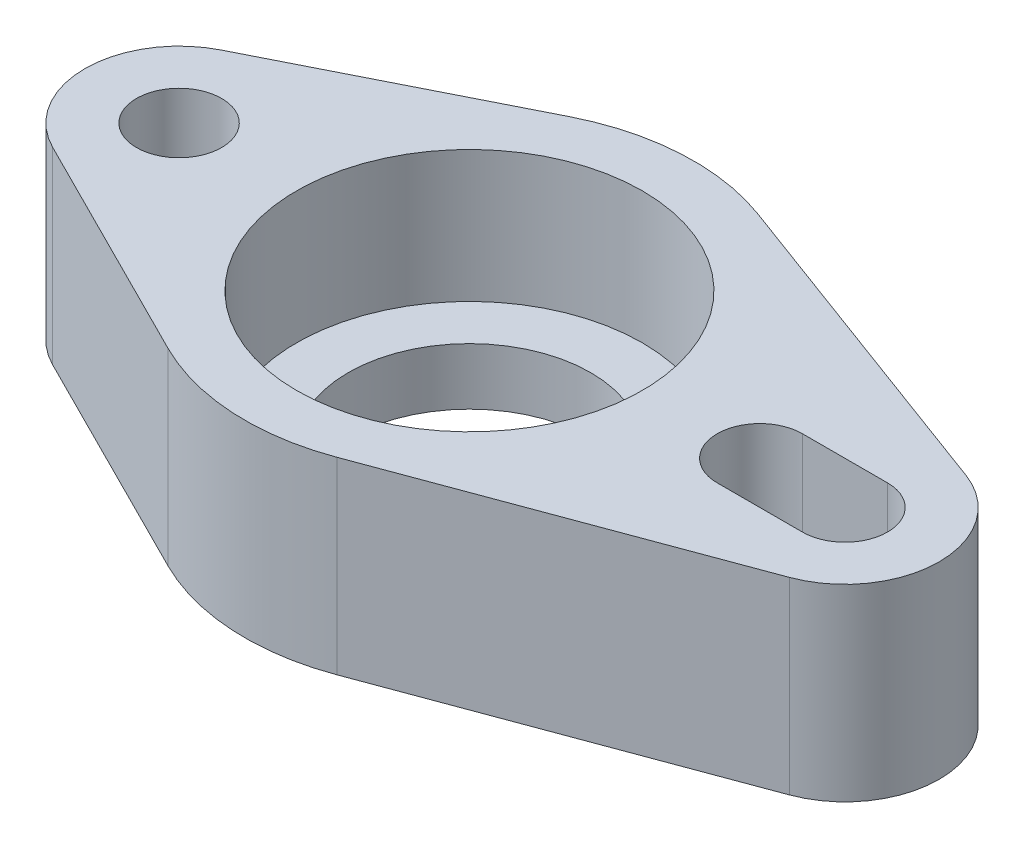
ISO-10303-21;
HEADER;
FILE_DESCRIPTION(('STEP AP214'),'2;1');
FILE_NAME('part.step','',(''),(''),'','','');
FILE_SCHEMA(('AUTOMOTIVE_DESIGN { 1 0 10303 214 1 1 1 1 }'));
ENDSEC;
DATA;
#1=APPLICATION_CONTEXT('core data for automotive mechanical design processes');
#2=APPLICATION_PROTOCOL_DEFINITION('international standard','automotive_design',2000,#1);
#3=PRODUCT_CONTEXT('',#1,'mechanical');
#4=PRODUCT('Part','Part','',(#3));
#5=PRODUCT_RELATED_PRODUCT_CATEGORY('part','',(#4));
#6=PRODUCT_DEFINITION_FORMATION('','',#4);
#7=PRODUCT_DEFINITION_CONTEXT('part definition',#1,'design');
#8=PRODUCT_DEFINITION('design','',#6,#7);
#9=PRODUCT_DEFINITION_SHAPE('','',#8);
#10=(LENGTH_UNIT() NAMED_UNIT(*) SI_UNIT(.MILLI.,.METRE.));
#11=(NAMED_UNIT(*) PLANE_ANGLE_UNIT() SI_UNIT($,.RADIAN.));
#12=(NAMED_UNIT(*) SI_UNIT($,.STERADIAN.) SOLID_ANGLE_UNIT());
#13=UNCERTAINTY_MEASURE_WITH_UNIT(LENGTH_MEASURE(1.E-05),#10,'distance_accuracy_value','');
#14=(GEOMETRIC_REPRESENTATION_CONTEXT(3) GLOBAL_UNCERTAINTY_ASSIGNED_CONTEXT((#13)) GLOBAL_UNIT_ASSIGNED_CONTEXT((#10,
#11,#12)) REPRESENTATION_CONTEXT('',''));
#15=CARTESIAN_POINT('',(0.,0.,0.));
#16=DIRECTION('',(0.,0.,1.));
#17=DIRECTION('',(1.,0.,0.));
#18=AXIS2_PLACEMENT_3D('',#15,#16,#17);
#19=CARTESIAN_POINT('',(3.01958762886598,7.3,8.15917217318029));
#20=DIRECTION('',(0.347079037800687,0.,0.937835881974746));
#21=DIRECTION('',(0.937835881974746,0.,-0.347079037800687));
#22=AXIS2_PLACEMENT_3D('',#19,#20,#21);
#23=PLANE('',#22);
#24=DIRECTION('',(-0.937835881974746,0.,0.347079037800687));
#25=VECTOR('',#24,1.);
#26=CARTESIAN_POINT('',(3.01958762886598,0.,8.15917217318029));
#27=LINE('',#26,#25);
#28=CARTESIAN_POINT('',(15.8168384879725,0.,3.42310096920782));
#29=VERTEX_POINT('',#28);
#30=CARTESIAN_POINT('',(3.01958762886598,0.,8.15917217318029));
#31=VERTEX_POINT('',#30);
#32=EDGE_CURVE('E211',#29,#31,#27,.T.);
#33=ORIENTED_EDGE('',*,*,#32,.F.);
#34=DIRECTION('',(0.,-1.,0.));
#35=VECTOR('',#34,1.);
#36=CARTESIAN_POINT('',(15.8168384879725,7.3,3.42310096920782));
#37=LINE('',#36,#35);
#38=CARTESIAN_POINT('',(15.8168384879725,7.3,3.42310096920782));
#39=VERTEX_POINT('',#38);
#40=EDGE_CURVE('E54',#39,#29,#37,.T.);
#41=ORIENTED_EDGE('',*,*,#40,.F.);
#42=DIRECTION('',(-0.937835881974746,0.,0.347079037800687));
#43=VECTOR('',#42,1.);
#44=CARTESIAN_POINT('',(3.01958762886598,7.3,8.15917217318029));
#45=LINE('',#44,#43);
#46=CARTESIAN_POINT('',(3.01958762886598,7.3,8.15917217318029));
#47=VERTEX_POINT('',#46);
#48=EDGE_CURVE('E240',#39,#47,#45,.T.);
#49=ORIENTED_EDGE('',*,*,#48,.T.);
#50=DIRECTION('',(0.,-1.,0.));
#51=VECTOR('',#50,1.);
#52=CARTESIAN_POINT('',(3.01958762886598,7.3,8.15917217318029));
#53=LINE('',#52,#51);
#54=EDGE_CURVE('E109',#47,#31,#53,.T.);
#55=ORIENTED_EDGE('',*,*,#54,.T.);
#56=EDGE_LOOP('',(#33,#41,#49,#55));
#57=FACE_BOUND('',#56,.T.);
#58=ADVANCED_FACE('F45',(#57),#23,.T.);
#59=CARTESIAN_POINT('',(14.55,7.3,0.));
#60=DIRECTION('',(0.,-1.,0.));
#61=DIRECTION('',(0.,0.,-1.));
#62=AXIS2_PLACEMENT_3D('',#59,#60,#61);
#63=CYLINDRICAL_SURFACE('',#62,3.65);
#64=CARTESIAN_POINT('',(14.55,0.,0.));
#65=DIRECTION('',(0.,1.,0.));
#66=DIRECTION('',(0.,0.,1.));
#67=AXIS2_PLACEMENT_3D('',#64,#65,#66);
#68=CIRCLE('',#67,3.65);
#69=CARTESIAN_POINT('',(15.8168384879725,0.,-3.42310096920782));
#70=VERTEX_POINT('',#69);
#71=EDGE_CURVE('E208',#29,#70,#68,.T.);
#72=ORIENTED_EDGE('',*,*,#71,.T.);
#73=DIRECTION('',(0.,-1.,0.));
#74=VECTOR('',#73,1.);
#75=CARTESIAN_POINT('',(15.8168384879725,7.3,-3.42310096920782));
#76=LINE('',#75,#74);
#77=CARTESIAN_POINT('',(15.8168384879725,7.3,-3.42310096920782));
#78=VERTEX_POINT('',#77);
#79=EDGE_CURVE('E177',#78,#70,#76,.T.);
#80=ORIENTED_EDGE('',*,*,#79,.F.);
#81=CARTESIAN_POINT('',(14.55,7.3,0.));
#82=DIRECTION('',(0.,1.,0.));
#83=DIRECTION('',(0.,0.,1.));
#84=AXIS2_PLACEMENT_3D('',#81,#82,#83);
#85=CIRCLE('',#84,3.65);
#86=EDGE_CURVE('E237',#39,#78,#85,.T.);
#87=ORIENTED_EDGE('',*,*,#86,.F.);
#88=ORIENTED_EDGE('',*,*,#40,.T.);
#89=EDGE_LOOP('',(#72,#80,#87,#88));
#90=FACE_BOUND('',#89,.T.);
#91=ADVANCED_FACE('F297',(#90),#63,.T.);
#92=CARTESIAN_POINT('',(3.01958762886598,7.3,-8.15917217318029));
#93=DIRECTION('',(-0.347079037800687,0.,0.937835881974746));
#94=DIRECTION('',(0.937835881974746,0.,0.347079037800687));
#95=AXIS2_PLACEMENT_3D('',#92,#93,#94);
#96=PLANE('',#95);
#97=DIRECTION('',(-0.937835881974746,0.,-0.347079037800687));
#98=VECTOR('',#97,1.);
#99=CARTESIAN_POINT('',(3.01958762886598,0.,-8.15917217318029));
#100=LINE('',#99,#98);
#101=CARTESIAN_POINT('',(3.01958762886598,0.,-8.15917217318029));
#102=VERTEX_POINT('',#101);
#103=EDGE_CURVE('E205',#70,#102,#100,.T.);
#104=ORIENTED_EDGE('',*,*,#103,.T.);
#105=DIRECTION('',(0.,-1.,0.));
#106=VECTOR('',#105,1.);
#107=CARTESIAN_POINT('',(3.01958762886598,7.3,-8.15917217318029));
#108=LINE('',#107,#106);
#109=CARTESIAN_POINT('',(3.01958762886598,7.3,-8.15917217318029));
#110=VERTEX_POINT('',#109);
#111=EDGE_CURVE('E174',#110,#102,#108,.T.);
#112=ORIENTED_EDGE('',*,*,#111,.F.);
#113=DIRECTION('',(-0.937835881974746,0.,-0.347079037800687));
#114=VECTOR('',#113,1.);
#115=CARTESIAN_POINT('',(3.01958762886598,7.3,-8.15917217318029));
#116=LINE('',#115,#114);
#117=EDGE_CURVE('E234',#78,#110,#116,.T.);
#118=ORIENTED_EDGE('',*,*,#117,.F.);
#119=ORIENTED_EDGE('',*,*,#79,.T.);
#120=EDGE_LOOP('',(#104,#112,#118,#119));
#121=FACE_BOUND('',#120,.T.);
#122=ADVANCED_FACE('F302',(#121),#96,.F.);
#123=CARTESIAN_POINT('',(0.,7.3,0.));
#124=DIRECTION('',(0.,-1.,0.));
#125=DIRECTION('',(0.,0.,-1.));
#126=AXIS2_PLACEMENT_3D('',#123,#124,#125);
#127=CYLINDRICAL_SURFACE('',#126,8.7);
#128=CARTESIAN_POINT('',(0.,0.,0.));
#129=DIRECTION('',(0.,1.,0.));
#130=DIRECTION('',(0.,0.,1.));
#131=AXIS2_PLACEMENT_3D('',#128,#129,#130);
#132=CIRCLE('',#131,8.7);
#133=CARTESIAN_POINT('',(-3.90533333333333,0.,-7.77421195720541));
#134=VERTEX_POINT('',#133);
#135=EDGE_CURVE('E202',#102,#134,#132,.T.);
#136=ORIENTED_EDGE('',*,*,#135,.T.);
#137=DIRECTION('',(0.,-1.,0.));
#138=VECTOR('',#137,1.);
#139=CARTESIAN_POINT('',(-3.90533333333333,7.3,-7.77421195720541));
#140=LINE('',#139,#138);
#141=CARTESIAN_POINT('',(-3.90533333333333,7.3,-7.77421195720541));
#142=VERTEX_POINT('',#141);
#143=EDGE_CURVE('E168',#142,#134,#140,.T.);
#144=ORIENTED_EDGE('',*,*,#143,.F.);
#145=CARTESIAN_POINT('',(0.,7.3,0.));
#146=DIRECTION('',(0.,1.,0.));
#147=DIRECTION('',(0.,0.,1.));
#148=AXIS2_PLACEMENT_3D('',#145,#146,#147);
#149=CIRCLE('',#148,8.7);
#150=EDGE_CURVE('E232',#110,#142,#149,.T.);
#151=ORIENTED_EDGE('',*,*,#150,.F.);
#152=ORIENTED_EDGE('',*,*,#111,.T.);
#153=EDGE_LOOP('',(#136,#144,#151,#152));
#154=FACE_BOUND('',#153,.T.);
#155=ADVANCED_FACE('F330',(#154),#127,.T.);
#156=CARTESIAN_POINT('',(-3.90533333333333,7.3,-7.77421195720541));
#157=DIRECTION('',(-0.448888888888889,0.,-0.893587581287978));
#158=DIRECTION('',(-0.893587581287978,0.,0.448888888888889));
#159=AXIS2_PLACEMENT_3D('',#156,#157,#158);
#160=PLANE('',#159);
#161=DIRECTION('',(0.893587581287978,0.,-0.448888888888889));
#162=VECTOR('',#161,1.);
#163=CARTESIAN_POINT('',(-3.90533333333333,0.,-7.77421195720541));
#164=LINE('',#163,#162);
#165=CARTESIAN_POINT('',(-12.8884444444444,0.,-3.26159467170112));
#166=VERTEX_POINT('',#165);
#167=EDGE_CURVE('E199',#166,#134,#164,.T.);
#168=ORIENTED_EDGE('',*,*,#167,.F.);
#169=DIRECTION('',(0.,-1.,0.));
#170=VECTOR('',#169,1.);
#171=CARTESIAN_POINT('',(-12.8884444444444,7.3,-3.26159467170112));
#172=LINE('',#171,#170);
#173=CARTESIAN_POINT('',(-12.8884444444444,7.3,-3.26159467170112));
#174=VERTEX_POINT('',#173);
#175=EDGE_CURVE('E166',#174,#166,#172,.T.);
#176=ORIENTED_EDGE('',*,*,#175,.F.);
#177=DIRECTION('',(0.893587581287978,0.,-0.448888888888889));
#178=VECTOR('',#177,1.);
#179=CARTESIAN_POINT('',(-3.90533333333333,7.3,-7.77421195720541));
#180=LINE('',#179,#178);
#181=EDGE_CURVE('E160',#174,#142,#180,.T.);
#182=ORIENTED_EDGE('',*,*,#181,.T.);
#183=ORIENTED_EDGE('',*,*,#143,.T.);
#184=EDGE_LOOP('',(#168,#176,#182,#183));
#185=FACE_BOUND('',#184,.T.);
#186=ADVANCED_FACE('F333',(#185),#160,.T.);
#187=CARTESIAN_POINT('',(-11.25,7.3,0.));
#188=DIRECTION('',(0.,-1.,0.));
#189=DIRECTION('',(0.,0.,-1.));
#190=AXIS2_PLACEMENT_3D('',#187,#188,#189);
#191=CYLINDRICAL_SURFACE('',#190,3.65);
#192=CARTESIAN_POINT('',(-11.25,0.,0.));
#193=DIRECTION('',(0.,1.,0.));
#194=DIRECTION('',(0.,0.,1.));
#195=AXIS2_PLACEMENT_3D('',#192,#193,#194);
#196=CIRCLE('',#195,3.65);
#197=CARTESIAN_POINT('',(-12.8884444444444,0.,3.26159467170112));
#198=VERTEX_POINT('',#197);
#199=EDGE_CURVE('E165',#166,#198,#196,.T.);
#200=ORIENTED_EDGE('',*,*,#199,.T.);
#201=DIRECTION('',(0.,-1.,0.));
#202=VECTOR('',#201,1.);
#203=CARTESIAN_POINT('',(-12.8884444444444,7.3,3.26159467170112));
#204=LINE('',#203,#202);
#205=CARTESIAN_POINT('',(-12.8884444444444,7.3,3.26159467170112));
#206=VERTEX_POINT('',#205);
#207=EDGE_CURVE('E150',#206,#198,#204,.T.);
#208=ORIENTED_EDGE('',*,*,#207,.F.);
#209=CARTESIAN_POINT('',(-11.25,7.3,0.));
#210=DIRECTION('',(0.,1.,0.));
#211=DIRECTION('',(0.,0.,1.));
#212=AXIS2_PLACEMENT_3D('',#209,#210,#211);
#213=CIRCLE('',#212,3.65);
#214=EDGE_CURVE('E153',#174,#206,#213,.T.);
#215=ORIENTED_EDGE('',*,*,#214,.F.);
#216=ORIENTED_EDGE('',*,*,#175,.T.);
#217=EDGE_LOOP('',(#200,#208,#215,#216));
#218=FACE_BOUND('',#217,.T.);
#219=ADVANCED_FACE('F163',(#218),#191,.T.);
#220=CARTESIAN_POINT('',(-3.90533333333333,7.3,7.77421195720541));
#221=DIRECTION('',(0.448888888888889,0.,-0.893587581287978));
#222=DIRECTION('',(-0.893587581287978,0.,-0.448888888888889));
#223=AXIS2_PLACEMENT_3D('',#220,#221,#222);
#224=PLANE('',#223);
#225=DIRECTION('',(0.893587581287978,0.,0.448888888888889));
#226=VECTOR('',#225,1.);
#227=CARTESIAN_POINT('',(-3.90533333333333,0.,7.77421195720541));
#228=LINE('',#227,#226);
#229=CARTESIAN_POINT('',(-3.90533333333333,0.,7.77421195720541));
#230=VERTEX_POINT('',#229);
#231=EDGE_CURVE('E196',#198,#230,#228,.T.);
#232=ORIENTED_EDGE('',*,*,#231,.T.);
#233=DIRECTION('',(0.,-1.,0.));
#234=VECTOR('',#233,1.);
#235=CARTESIAN_POINT('',(-3.90533333333333,7.3,7.77421195720541));
#236=LINE('',#235,#234);
#237=CARTESIAN_POINT('',(-3.90533333333333,7.3,7.77421195720541));
#238=VERTEX_POINT('',#237);
#239=EDGE_CURVE('E152',#238,#230,#236,.T.);
#240=ORIENTED_EDGE('',*,*,#239,.F.);
#241=DIRECTION('',(0.893587581287978,0.,0.448888888888889));
#242=VECTOR('',#241,1.);
#243=CARTESIAN_POINT('',(-3.90533333333333,7.3,7.77421195720541));
#244=LINE('',#243,#242);
#245=EDGE_CURVE('E145',#206,#238,#244,.T.);
#246=ORIENTED_EDGE('',*,*,#245,.F.);
#247=ORIENTED_EDGE('',*,*,#207,.T.);
#248=EDGE_LOOP('',(#232,#240,#246,#247));
#249=FACE_BOUND('',#248,.T.);
#250=ADVANCED_FACE('F148',(#249),#224,.F.);
#251=CARTESIAN_POINT('',(11.25,7.3,0.));
#252=DIRECTION('',(0.,-1.,0.));
#253=DIRECTION('',(0.,0.,-1.));
#254=AXIS2_PLACEMENT_3D('',#251,#252,#253);
#255=CYLINDRICAL_SURFACE('',#254,1.65);
#256=CARTESIAN_POINT('',(11.25,0.,0.));
#257=DIRECTION('',(0.,1.,0.));
#258=DIRECTION('',(0.,0.,1.));
#259=AXIS2_PLACEMENT_3D('',#256,#257,#258);
#260=CIRCLE('',#259,1.65);
#261=CARTESIAN_POINT('',(11.25,0.,-1.65));
#262=VERTEX_POINT('',#261);
#263=CARTESIAN_POINT('',(11.25,0.,1.65));
#264=VERTEX_POINT('',#263);
#265=EDGE_CURVE('E221',#262,#264,#260,.T.);
#266=ORIENTED_EDGE('',*,*,#265,.F.);
#267=DIRECTION('',(0.,-1.,0.));
#268=VECTOR('',#267,1.);
#269=CARTESIAN_POINT('',(11.25,7.3,-1.65));
#270=LINE('',#269,#268);
#271=CARTESIAN_POINT('',(11.25,7.3,-1.65));
#272=VERTEX_POINT('',#271);
#273=EDGE_CURVE('E116',#272,#262,#270,.T.);
#274=ORIENTED_EDGE('',*,*,#273,.F.);
#275=CARTESIAN_POINT('',(11.25,7.3,0.));
#276=DIRECTION('',(0.,1.,0.));
#277=DIRECTION('',(0.,0.,1.));
#278=AXIS2_PLACEMENT_3D('',#275,#276,#277);
#279=CIRCLE('',#278,1.65);
#280=CARTESIAN_POINT('',(11.25,7.3,1.65));
#281=VERTEX_POINT('',#280);
#282=EDGE_CURVE('E194',#272,#281,#279,.T.);
#283=ORIENTED_EDGE('',*,*,#282,.T.);
#284=DIRECTION('',(0.,-1.,0.));
#285=VECTOR('',#284,1.);
#286=CARTESIAN_POINT('',(11.25,7.3,1.65));
#287=LINE('',#286,#285);
#288=EDGE_CURVE('E181',#281,#264,#287,.T.);
#289=ORIENTED_EDGE('',*,*,#288,.T.);
#290=EDGE_LOOP('',(#266,#274,#283,#289));
#291=FACE_BOUND('',#290,.T.);
#292=ADVANCED_FACE('F47',(#291),#255,.F.);
#293=CARTESIAN_POINT('',(0.,7.3,-1.65));
#294=DIRECTION('',(0.,0.,-1.));
#295=DIRECTION('',(-1.,0.,0.));
#296=AXIS2_PLACEMENT_3D('',#293,#294,#295);
#297=PLANE('',#296);
#298=DIRECTION('',(1.,0.,0.));
#299=VECTOR('',#298,1.);
#300=CARTESIAN_POINT('',(0.,0.,-1.65));
#301=LINE('',#300,#299);
#302=CARTESIAN_POINT('',(14.55,0.,-1.65));
#303=VERTEX_POINT('',#302);
#304=EDGE_CURVE('E219',#262,#303,#301,.T.);
#305=ORIENTED_EDGE('',*,*,#304,.T.);
#306=DIRECTION('',(0.,-1.,0.));
#307=VECTOR('',#306,1.);
#308=CARTESIAN_POINT('',(14.55,7.3,-1.65));
#309=LINE('',#308,#307);
#310=CARTESIAN_POINT('',(14.55,7.3,-1.65));
#311=VERTEX_POINT('',#310);
#312=EDGE_CURVE('E186',#311,#303,#309,.T.);
#313=ORIENTED_EDGE('',*,*,#312,.F.);
#314=DIRECTION('',(1.,0.,0.));
#315=VECTOR('',#314,1.);
#316=CARTESIAN_POINT('',(0.,7.3,-1.65));
#317=LINE('',#316,#315);
#318=EDGE_CURVE('E248',#272,#311,#317,.T.);
#319=ORIENTED_EDGE('',*,*,#318,.F.);
#320=ORIENTED_EDGE('',*,*,#273,.T.);
#321=EDGE_LOOP('',(#305,#313,#319,#320));
#322=FACE_BOUND('',#321,.T.);
#323=ADVANCED_FACE('F311',(#322),#297,.F.);
#324=CARTESIAN_POINT('',(14.55,7.3,0.));
#325=DIRECTION('',(0.,-1.,0.));
#326=DIRECTION('',(0.,0.,-1.));
#327=AXIS2_PLACEMENT_3D('',#324,#325,#326);
#328=CYLINDRICAL_SURFACE('',#327,1.65);
#329=CARTESIAN_POINT('',(14.55,0.,0.));
#330=DIRECTION('',(0.,1.,0.));
#331=DIRECTION('',(0.,0.,1.));
#332=AXIS2_PLACEMENT_3D('',#329,#330,#331);
#333=CIRCLE('',#332,1.65);
#334=CARTESIAN_POINT('',(14.55,0.,1.65));
#335=VERTEX_POINT('',#334);
#336=EDGE_CURVE('E216',#335,#303,#333,.T.);
#337=ORIENTED_EDGE('',*,*,#336,.F.);
#338=DIRECTION('',(0.,-1.,0.));
#339=VECTOR('',#338,1.);
#340=CARTESIAN_POINT('',(14.55,7.3,1.65));
#341=LINE('',#340,#339);
#342=CARTESIAN_POINT('',(14.55,7.3,1.65));
#343=VERTEX_POINT('',#342);
#344=EDGE_CURVE('E183',#343,#335,#341,.T.);
#345=ORIENTED_EDGE('',*,*,#344,.F.);
#346=CARTESIAN_POINT('',(14.55,7.3,0.));
#347=DIRECTION('',(0.,1.,0.));
#348=DIRECTION('',(0.,0.,1.));
#349=AXIS2_PLACEMENT_3D('',#346,#347,#348);
#350=CIRCLE('',#349,1.65);
#351=EDGE_CURVE('E245',#343,#311,#350,.T.);
#352=ORIENTED_EDGE('',*,*,#351,.T.);
#353=ORIENTED_EDGE('',*,*,#312,.T.);
#354=EDGE_LOOP('',(#337,#345,#352,#353));
#355=FACE_BOUND('',#354,.T.);
#356=ADVANCED_FACE('F270',(#355),#328,.F.);
#357=CARTESIAN_POINT('',(0.,7.3,0.));
#358=DIRECTION('',(0.,-1.,0.));
#359=DIRECTION('',(0.,0.,-1.));
#360=AXIS2_PLACEMENT_3D('',#357,#358,#359);
#361=CYLINDRICAL_SURFACE('',#360,6.7);
#362=CARTESIAN_POINT('',(0.,2.2,0.));
#363=DIRECTION('',(0.,1.,0.));
#364=DIRECTION('',(0.,0.,1.));
#365=AXIS2_PLACEMENT_3D('',#362,#363,#364);
#366=CIRCLE('',#365,6.7);
#367=CARTESIAN_POINT('',(0.,2.2,6.7));
#368=VERTEX_POINT('',#367);
#369=EDGE_CURVE('E11',#368,#368,#366,.T.);
#370=ORIENTED_EDGE('',*,*,#369,.F.);
#371=EDGE_LOOP('',(#370));
#372=FACE_BOUND('',#371,.T.);
#373=CARTESIAN_POINT('',(0.,7.3,0.));
#374=DIRECTION('',(0.,1.,0.));
#375=DIRECTION('',(0.,0.,1.));
#376=AXIS2_PLACEMENT_3D('',#373,#374,#375);
#377=CIRCLE('',#376,6.7);
#378=CARTESIAN_POINT('',(0.,7.3,6.7));
#379=VERTEX_POINT('',#378);
#380=EDGE_CURVE('E227',#379,#379,#377,.T.);
#381=ORIENTED_EDGE('',*,*,#380,.T.);
#382=EDGE_LOOP('',(#381));
#383=FACE_BOUND('',#382,.T.);
#384=ADVANCED_FACE('F266',(#372,#383),#361,.F.);
#385=CARTESIAN_POINT('',(0.,7.3,0.));
#386=DIRECTION('',(0.,-1.,0.));
#387=DIRECTION('',(0.,0.,-1.));
#388=AXIS2_PLACEMENT_3D('',#385,#386,#387);
#389=CYLINDRICAL_SURFACE('',#388,8.7);
#390=CARTESIAN_POINT('',(0.,0.,0.));
#391=DIRECTION('',(0.,1.,0.));
#392=DIRECTION('',(0.,0.,1.));
#393=AXIS2_PLACEMENT_3D('',#390,#391,#392);
#394=CIRCLE('',#393,8.7);
#395=EDGE_CURVE('E102',#230,#31,#394,.T.);
#396=ORIENTED_EDGE('',*,*,#395,.T.);
#397=ORIENTED_EDGE('',*,*,#54,.F.);
#398=CARTESIAN_POINT('',(0.,7.3,0.));
#399=DIRECTION('',(0.,1.,0.));
#400=DIRECTION('',(0.,0.,1.));
#401=AXIS2_PLACEMENT_3D('',#398,#399,#400);
#402=CIRCLE('',#401,8.7);
#403=EDGE_CURVE('E62',#238,#47,#402,.T.);
#404=ORIENTED_EDGE('',*,*,#403,.F.);
#405=ORIENTED_EDGE('',*,*,#239,.T.);
#406=EDGE_LOOP('',(#396,#397,#404,#405));
#407=FACE_BOUND('',#406,.T.);
#408=ADVANCED_FACE('F269',(#407),#389,.T.);
#409=CARTESIAN_POINT('',(0.,7.3,1.65));
#410=DIRECTION('',(0.,0.,-1.));
#411=DIRECTION('',(-1.,0.,0.));
#412=AXIS2_PLACEMENT_3D('',#409,#410,#411);
#413=PLANE('',#412);
#414=DIRECTION('',(1.,0.,0.));
#415=VECTOR('',#414,1.);
#416=CARTESIAN_POINT('',(0.,0.,1.65));
#417=LINE('',#416,#415);
#418=EDGE_CURVE('E213',#264,#335,#417,.T.);
#419=ORIENTED_EDGE('',*,*,#418,.F.);
#420=ORIENTED_EDGE('',*,*,#288,.F.);
#421=DIRECTION('',(1.,0.,0.));
#422=VECTOR('',#421,1.);
#423=CARTESIAN_POINT('',(0.,7.3,1.65));
#424=LINE('',#423,#422);
#425=EDGE_CURVE('E242',#281,#343,#424,.T.);
#426=ORIENTED_EDGE('',*,*,#425,.T.);
#427=ORIENTED_EDGE('',*,*,#344,.T.);
#428=EDGE_LOOP('',(#419,#420,#426,#427));
#429=FACE_BOUND('',#428,.T.);
#430=ADVANCED_FACE('F283',(#429),#413,.T.);
#431=CARTESIAN_POINT('',(-11.25,7.3,0.));
#432=DIRECTION('',(0.,-1.,0.));
#433=DIRECTION('',(0.,0.,-1.));
#434=AXIS2_PLACEMENT_3D('',#431,#432,#433);
#435=CYLINDRICAL_SURFACE('',#434,1.65);
#436=CARTESIAN_POINT('',(-11.25,7.3,0.));
#437=DIRECTION('',(0.,1.,0.));
#438=DIRECTION('',(0.,0.,1.));
#439=AXIS2_PLACEMENT_3D('',#436,#437,#438);
#440=CIRCLE('',#439,1.65);
#441=CARTESIAN_POINT('',(-11.25,7.3,1.65));
#442=VERTEX_POINT('',#441);
#443=EDGE_CURVE('E184',#442,#442,#440,.T.);
#444=ORIENTED_EDGE('',*,*,#443,.T.);
#445=EDGE_LOOP('',(#444));
#446=FACE_BOUND('',#445,.T.);
#447=CARTESIAN_POINT('',(-11.25,0.,0.));
#448=DIRECTION('',(0.,1.,0.));
#449=DIRECTION('',(0.,0.,1.));
#450=AXIS2_PLACEMENT_3D('',#447,#448,#449);
#451=CIRCLE('',#450,1.65);
#452=CARTESIAN_POINT('',(-11.25,0.,1.65));
#453=VERTEX_POINT('',#452);
#454=EDGE_CURVE('E191',#453,#453,#451,.T.);
#455=ORIENTED_EDGE('',*,*,#454,.F.);
#456=EDGE_LOOP('',(#455));
#457=FACE_BOUND('',#456,.T.);
#458=ADVANCED_FACE('F276',(#446,#457),#435,.F.);
#459=CARTESIAN_POINT('',(0.,7.3,0.));
#460=DIRECTION('',(0.,1.,0.));
#461=DIRECTION('',(0.,0.,1.));
#462=AXIS2_PLACEMENT_3D('',#459,#460,#461);
#463=PLANE('',#462);
#464=ORIENTED_EDGE('',*,*,#282,.F.);
#465=ORIENTED_EDGE('',*,*,#318,.T.);
#466=ORIENTED_EDGE('',*,*,#351,.F.);
#467=ORIENTED_EDGE('',*,*,#425,.F.);
#468=EDGE_LOOP('',(#464,#465,#466,#467));
#469=FACE_BOUND('',#468,.T.);
#470=ORIENTED_EDGE('',*,*,#48,.F.);
#471=ORIENTED_EDGE('',*,*,#86,.T.);
#472=ORIENTED_EDGE('',*,*,#117,.T.);
#473=ORIENTED_EDGE('',*,*,#150,.T.);
#474=ORIENTED_EDGE('',*,*,#181,.F.);
#475=ORIENTED_EDGE('',*,*,#214,.T.);
#476=ORIENTED_EDGE('',*,*,#245,.T.);
#477=ORIENTED_EDGE('',*,*,#403,.T.);
#478=EDGE_LOOP('',(#470,#471,#472,#473,#474,#475,#476,#477));
#479=FACE_BOUND('',#478,.T.);
#480=ORIENTED_EDGE('',*,*,#380,.F.);
#481=EDGE_LOOP('',(#480));
#482=FACE_BOUND('',#481,.T.);
#483=ORIENTED_EDGE('',*,*,#443,.F.);
#484=EDGE_LOOP('',(#483));
#485=FACE_BOUND('',#484,.T.);
#486=ADVANCED_FACE('F157',(#469,#479,#482,#485),#463,.T.);
#487=CARTESIAN_POINT('',(0.,0.,0.));
#488=DIRECTION('',(0.,1.,0.));
#489=DIRECTION('',(0.,0.,1.));
#490=AXIS2_PLACEMENT_3D('',#487,#488,#489);
#491=PLANE('',#490);
#492=ORIENTED_EDGE('',*,*,#265,.T.);
#493=ORIENTED_EDGE('',*,*,#418,.T.);
#494=ORIENTED_EDGE('',*,*,#336,.T.);
#495=ORIENTED_EDGE('',*,*,#304,.F.);
#496=EDGE_LOOP('',(#492,#493,#494,#495));
#497=FACE_BOUND('',#496,.T.);
#498=ORIENTED_EDGE('',*,*,#32,.T.);
#499=ORIENTED_EDGE('',*,*,#395,.F.);
#500=ORIENTED_EDGE('',*,*,#231,.F.);
#501=ORIENTED_EDGE('',*,*,#199,.F.);
#502=ORIENTED_EDGE('',*,*,#167,.T.);
#503=ORIENTED_EDGE('',*,*,#135,.F.);
#504=ORIENTED_EDGE('',*,*,#103,.F.);
#505=ORIENTED_EDGE('',*,*,#71,.F.);
#506=EDGE_LOOP('',(#498,#499,#500,#501,#502,#503,#504,#505));
#507=FACE_BOUND('',#506,.T.);
#508=ORIENTED_EDGE('',*,*,#454,.T.);
#509=EDGE_LOOP('',(#508));
#510=FACE_BOUND('',#509,.T.);
#511=CARTESIAN_POINT('',(0.,0.,0.));
#512=DIRECTION('',(0.,1.,0.));
#513=DIRECTION('',(0.,0.,1.));
#514=AXIS2_PLACEMENT_3D('',#511,#512,#513);
#515=CIRCLE('',#514,4.7);
#516=CARTESIAN_POINT('',(0.,0.,4.7));
#517=VERTEX_POINT('',#516);
#518=EDGE_CURVE('E251',#517,#517,#515,.T.);
#519=ORIENTED_EDGE('',*,*,#518,.T.);
#520=EDGE_LOOP('',(#519));
#521=FACE_BOUND('',#520,.T.);
#522=ADVANCED_FACE('F275',(#497,#507,#510,#521),#491,.F.);
#523=CARTESIAN_POINT('',(0.,2.2,0.));
#524=DIRECTION('',(0.,-1.,0.));
#525=DIRECTION('',(0.,0.,-1.));
#526=AXIS2_PLACEMENT_3D('',#523,#524,#525);
#527=CYLINDRICAL_SURFACE('',#526,4.7);
#528=CARTESIAN_POINT('',(0.,2.2,0.));
#529=DIRECTION('',(0.,1.,0.));
#530=DIRECTION('',(0.,0.,1.));
#531=AXIS2_PLACEMENT_3D('',#528,#529,#530);
#532=CIRCLE('',#531,4.7);
#533=CARTESIAN_POINT('',(0.,2.2,4.7));
#534=VERTEX_POINT('',#533);
#535=EDGE_CURVE('E224',#534,#534,#532,.T.);
#536=ORIENTED_EDGE('',*,*,#535,.T.);
#537=EDGE_LOOP('',(#536));
#538=FACE_BOUND('',#537,.T.);
#539=ORIENTED_EDGE('',*,*,#518,.F.);
#540=EDGE_LOOP('',(#539));
#541=FACE_BOUND('',#540,.T.);
#542=ADVANCED_FACE('F257',(#538,#541),#527,.F.);
#543=CARTESIAN_POINT('',(0.,2.2,0.));
#544=DIRECTION('',(0.,1.,0.));
#545=DIRECTION('',(0.,0.,1.));
#546=AXIS2_PLACEMENT_3D('',#543,#544,#545);
#547=PLANE('',#546);
#548=ORIENTED_EDGE('',*,*,#535,.F.);
#549=EDGE_LOOP('',(#548));
#550=FACE_BOUND('',#549,.T.);
#551=ORIENTED_EDGE('',*,*,#369,.T.);
#552=EDGE_LOOP('',(#551));
#553=FACE_BOUND('',#552,.T.);
#554=ADVANCED_FACE('F260',(#550,#553),#547,.T.);
#555=CLOSED_SHELL('',(#58,#91,#122,#155,#186,#219,#250,#292,#323,#356,#384,#408,#430,#458,#486,
#522,#542,#554));
#556=MANIFOLD_SOLID_BREP('B2',#555);
#557=ADVANCED_BREP_SHAPE_REPRESENTATION('',(#18,#556),#14);
#558=SHAPE_DEFINITION_REPRESENTATION(#9,#557);
ENDSEC;
END-ISO-10303-21;
